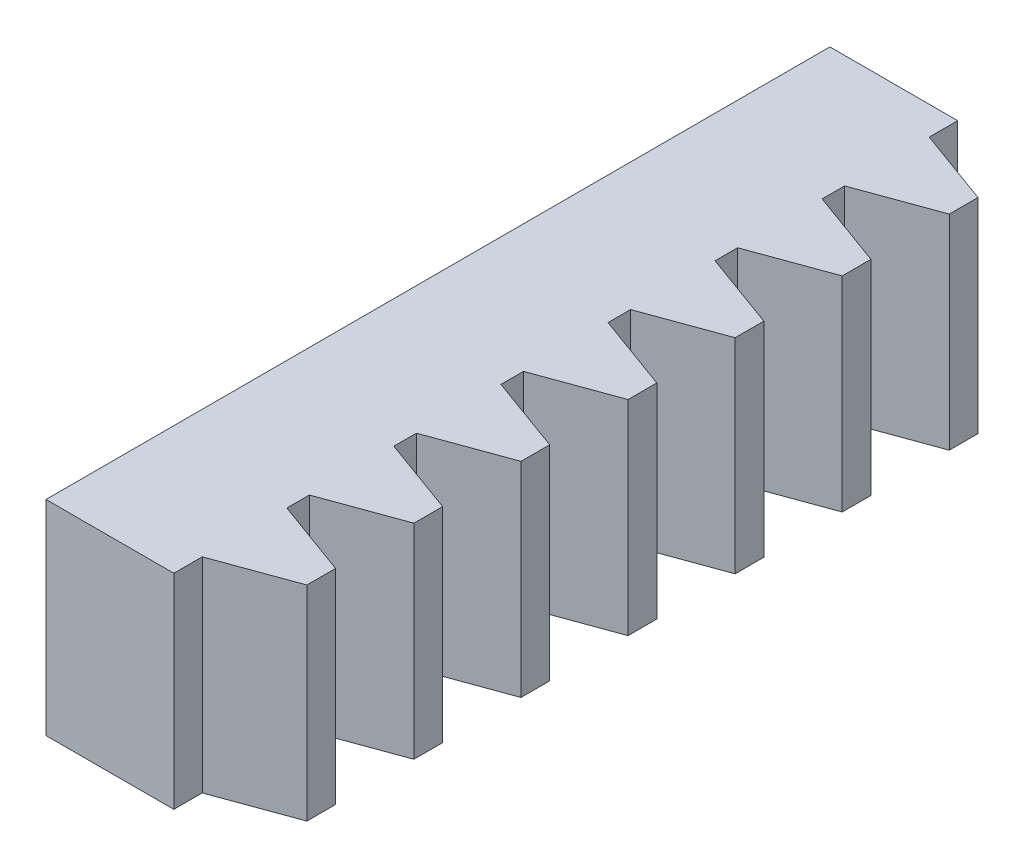
ISO-10303-21;
HEADER;
FILE_DESCRIPTION(('STEP AP214'),'2;1');
FILE_NAME('part.step','',(''),(''),'','','');
FILE_SCHEMA(('AUTOMOTIVE_DESIGN { 1 0 10303 214 1 1 1 1 }'));
ENDSEC;
DATA;
#1=APPLICATION_CONTEXT('core data for automotive mechanical design processes');
#2=APPLICATION_PROTOCOL_DEFINITION('international standard','automotive_design',2000,#1);
#3=PRODUCT_CONTEXT('',#1,'mechanical');
#4=PRODUCT('Part','Part','',(#3));
#5=PRODUCT_RELATED_PRODUCT_CATEGORY('part','',(#4));
#6=PRODUCT_DEFINITION_FORMATION('','',#4);
#7=PRODUCT_DEFINITION_CONTEXT('part definition',#1,'design');
#8=PRODUCT_DEFINITION('design','',#6,#7);
#9=PRODUCT_DEFINITION_SHAPE('','',#8);
#10=(LENGTH_UNIT() NAMED_UNIT(*) SI_UNIT(.MILLI.,.METRE.));
#11=(NAMED_UNIT(*) PLANE_ANGLE_UNIT() SI_UNIT($,.RADIAN.));
#12=(NAMED_UNIT(*) SI_UNIT($,.STERADIAN.) SOLID_ANGLE_UNIT());
#13=UNCERTAINTY_MEASURE_WITH_UNIT(LENGTH_MEASURE(1.E-05),#10,'distance_accuracy_value','');
#14=(GEOMETRIC_REPRESENTATION_CONTEXT(3) GLOBAL_UNCERTAINTY_ASSIGNED_CONTEXT((#13)) GLOBAL_UNIT_ASSIGNED_CONTEXT((#10,
#11,#12)) REPRESENTATION_CONTEXT('',''));
#15=CARTESIAN_POINT('',(0.,0.,0.));
#16=DIRECTION('',(0.,0.,1.));
#17=DIRECTION('',(1.,0.,0.));
#18=AXIS2_PLACEMENT_3D('',#15,#16,#17);
#19=CARTESIAN_POINT('',(0.75,-3.,-12.));
#20=DIRECTION('',(-1.,0.,0.));
#21=DIRECTION('',(0.,0.,1.));
#22=AXIS2_PLACEMENT_3D('',#19,#20,#21);
#23=PLANE('',#22);
#24=DIRECTION('',(0.,-1.,0.));
#25=VECTOR('',#24,1.);
#26=CARTESIAN_POINT('',(0.75,-3.,7.5236));
#27=LINE('',#26,#25);
#28=CARTESIAN_POINT('',(0.75,3.,7.5236));
#29=VERTEX_POINT('',#28);
#30=CARTESIAN_POINT('',(0.75,-3.,7.5236));
#31=VERTEX_POINT('',#30);
#32=EDGE_CURVE('E11',#29,#31,#27,.T.);
#33=ORIENTED_EDGE('',*,*,#32,.F.);
#34=DIRECTION('',(0.,0.,1.));
#35=VECTOR('',#34,1.);
#36=CARTESIAN_POINT('',(0.75,3.,-12.));
#37=LINE('',#36,#35);
#38=CARTESIAN_POINT('',(0.75,3.,8.1844));
#39=VERTEX_POINT('',#38);
#40=EDGE_CURVE('E612',#29,#39,#37,.T.);
#41=ORIENTED_EDGE('',*,*,#40,.T.);
#42=DIRECTION('',(0.,1.,0.));
#43=VECTOR('',#42,1.);
#44=CARTESIAN_POINT('',(0.75,-3.,8.1844));
#45=LINE('',#44,#43);
#46=CARTESIAN_POINT('',(0.75,-3.,8.1844));
#47=VERTEX_POINT('',#46);
#48=EDGE_CURVE('E443',#47,#39,#45,.T.);
#49=ORIENTED_EDGE('',*,*,#48,.F.);
#50=DIRECTION('',(0.,0.,1.));
#51=VECTOR('',#50,1.);
#52=CARTESIAN_POINT('',(0.75,-3.,-12.));
#53=LINE('',#52,#51);
#54=EDGE_CURVE('E491',#31,#47,#53,.T.);
#55=ORIENTED_EDGE('',*,*,#54,.F.);
#56=EDGE_LOOP('',(#33,#41,#49,#55));
#57=FACE_BOUND('',#56,.T.);
#58=ADVANCED_FACE('F41',(#57),#23,.F.);
#59=DIRECTION('',(0.,1.,0.));
#60=VECTOR('',#59,1.);
#61=CARTESIAN_POINT('',(0.75,-3.,5.0428));
#62=LINE('',#61,#60);
#63=CARTESIAN_POINT('',(0.75,-3.,5.0428));
#64=VERTEX_POINT('',#63);
#65=CARTESIAN_POINT('',(0.75,3.,5.0428));
#66=VERTEX_POINT('',#65);
#67=EDGE_CURVE('E47',#64,#66,#62,.T.);
#68=ORIENTED_EDGE('',*,*,#67,.F.);
#69=CARTESIAN_POINT('',(0.75,-3.,4.382));
#70=VERTEX_POINT('',#69);
#71=EDGE_CURVE('E489',#70,#64,#53,.T.);
#72=ORIENTED_EDGE('',*,*,#71,.F.);
#73=DIRECTION('',(0.,-1.,0.));
#74=VECTOR('',#73,1.);
#75=CARTESIAN_POINT('',(0.75,-3.,4.382));
#76=LINE('',#75,#74);
#77=CARTESIAN_POINT('',(0.75,3.,4.382));
#78=VERTEX_POINT('',#77);
#79=EDGE_CURVE('E464',#78,#70,#76,.T.);
#80=ORIENTED_EDGE('',*,*,#79,.F.);
#81=EDGE_CURVE('E478',#78,#66,#37,.T.);
#82=ORIENTED_EDGE('',*,*,#81,.T.);
#83=EDGE_LOOP('',(#68,#72,#80,#82));
#84=FACE_BOUND('',#83,.T.);
#85=ADVANCED_FACE('F546',(#84),#23,.F.);
#86=DIRECTION('',(0.,-1.,0.));
#87=VECTOR('',#86,1.);
#88=CARTESIAN_POINT('',(0.75,-3.,-5.0428));
#89=LINE('',#88,#87);
#90=CARTESIAN_POINT('',(0.75,3.,-5.0428));
#91=VERTEX_POINT('',#90);
#92=CARTESIAN_POINT('',(0.75,-3.,-5.0428));
#93=VERTEX_POINT('',#92);
#94=EDGE_CURVE('E466',#91,#93,#89,.T.);
#95=ORIENTED_EDGE('',*,*,#94,.F.);
#96=CARTESIAN_POINT('',(0.75,3.,-4.382));
#97=VERTEX_POINT('',#96);
#98=EDGE_CURVE('E578',#91,#97,#37,.T.);
#99=ORIENTED_EDGE('',*,*,#98,.T.);
#100=DIRECTION('',(0.,1.,0.));
#101=VECTOR('',#100,1.);
#102=CARTESIAN_POINT('',(0.75,-3.,-4.382));
#103=LINE('',#102,#101);
#104=CARTESIAN_POINT('',(0.75,-3.,-4.382));
#105=VERTEX_POINT('',#104);
#106=EDGE_CURVE('E455',#105,#97,#103,.T.);
#107=ORIENTED_EDGE('',*,*,#106,.F.);
#108=EDGE_CURVE('E597',#93,#105,#53,.T.);
#109=ORIENTED_EDGE('',*,*,#108,.F.);
#110=EDGE_LOOP('',(#95,#99,#107,#109));
#111=FACE_BOUND('',#110,.T.);
#112=ADVANCED_FACE('F554',(#111),#23,.F.);
#113=DIRECTION('',(0.,1.,0.));
#114=VECTOR('',#113,1.);
#115=CARTESIAN_POINT('',(0.75,-3.,-7.5236));
#116=LINE('',#115,#114);
#117=CARTESIAN_POINT('',(0.75,-3.,-7.5236));
#118=VERTEX_POINT('',#117);
#119=CARTESIAN_POINT('',(0.75,3.,-7.5236));
#120=VERTEX_POINT('',#119);
#121=EDGE_CURVE('E461',#118,#120,#116,.T.);
#122=ORIENTED_EDGE('',*,*,#121,.F.);
#123=CARTESIAN_POINT('',(0.75,-3.,-8.1844));
#124=VERTEX_POINT('',#123);
#125=EDGE_CURVE('E415',#124,#118,#53,.T.);
#126=ORIENTED_EDGE('',*,*,#125,.F.);
#127=DIRECTION('',(0.,-1.,0.));
#128=VECTOR('',#127,1.);
#129=CARTESIAN_POINT('',(0.75,-3.,-8.1844));
#130=LINE('',#129,#128);
#131=CARTESIAN_POINT('',(0.75,3.,-8.1844));
#132=VERTEX_POINT('',#131);
#133=EDGE_CURVE('E448',#132,#124,#130,.T.);
#134=ORIENTED_EDGE('',*,*,#133,.F.);
#135=EDGE_CURVE('E406',#132,#120,#37,.T.);
#136=ORIENTED_EDGE('',*,*,#135,.T.);
#137=EDGE_LOOP('',(#122,#126,#134,#136));
#138=FACE_BOUND('',#137,.T.);
#139=ADVANCED_FACE('F569',(#138),#23,.F.);
#140=DIRECTION('',(0.,1.,0.));
#141=VECTOR('',#140,1.);
#142=CARTESIAN_POINT('',(0.75,-3.,1.9012));
#143=LINE('',#142,#141);
#144=CARTESIAN_POINT('',(0.75,-3.,1.9012));
#145=VERTEX_POINT('',#144);
#146=CARTESIAN_POINT('',(0.75,3.,1.9012));
#147=VERTEX_POINT('',#146);
#148=EDGE_CURVE('E458',#145,#147,#143,.T.);
#149=ORIENTED_EDGE('',*,*,#148,.F.);
#150=CARTESIAN_POINT('',(0.75,-3.,1.2404));
#151=VERTEX_POINT('',#150);
#152=EDGE_CURVE('E495',#151,#145,#53,.T.);
#153=ORIENTED_EDGE('',*,*,#152,.F.);
#154=DIRECTION('',(0.,-1.,0.));
#155=VECTOR('',#154,1.);
#156=CARTESIAN_POINT('',(0.75,-3.,1.2404));
#157=LINE('',#156,#155);
#158=CARTESIAN_POINT('',(0.75,3.,1.2404));
#159=VERTEX_POINT('',#158);
#160=EDGE_CURVE('E441',#159,#151,#157,.T.);
#161=ORIENTED_EDGE('',*,*,#160,.F.);
#162=EDGE_CURVE('E582',#159,#147,#37,.T.);
#163=ORIENTED_EDGE('',*,*,#162,.T.);
#164=EDGE_LOOP('',(#149,#153,#161,#163));
#165=FACE_BOUND('',#164,.T.);
#166=ADVANCED_FACE('F564',(#165),#23,.F.);
#167=DIRECTION('',(0.,-1.,0.));
#168=VECTOR('',#167,1.);
#169=CARTESIAN_POINT('',(0.75,-3.,-1.9012));
#170=LINE('',#169,#168);
#171=CARTESIAN_POINT('',(0.75,3.,-1.9012));
#172=VERTEX_POINT('',#171);
#173=CARTESIAN_POINT('',(0.75,-3.,-1.9012));
#174=VERTEX_POINT('',#173);
#175=EDGE_CURVE('E456',#172,#174,#170,.T.);
#176=ORIENTED_EDGE('',*,*,#175,.F.);
#177=CARTESIAN_POINT('',(0.75,3.,-1.2404));
#178=VERTEX_POINT('',#177);
#179=EDGE_CURVE('E572',#172,#178,#37,.T.);
#180=ORIENTED_EDGE('',*,*,#179,.T.);
#181=DIRECTION('',(0.,1.,0.));
#182=VECTOR('',#181,1.);
#183=CARTESIAN_POINT('',(0.75,-3.,-1.2404));
#184=LINE('',#183,#182);
#185=CARTESIAN_POINT('',(0.75,-3.,-1.2404));
#186=VERTEX_POINT('',#185);
#187=EDGE_CURVE('E438',#186,#178,#184,.T.);
#188=ORIENTED_EDGE('',*,*,#187,.F.);
#189=EDGE_CURVE('E492',#174,#186,#53,.T.);
#190=ORIENTED_EDGE('',*,*,#189,.F.);
#191=EDGE_LOOP('',(#176,#180,#188,#190));
#192=FACE_BOUND('',#191,.T.);
#193=ADVANCED_FACE('F561',(#192),#23,.F.);
#194=DIRECTION('',(0.,1.,0.));
#195=VECTOR('',#194,1.);
#196=CARTESIAN_POINT('',(0.75,-3.,-10.6652));
#197=LINE('',#196,#195);
#198=CARTESIAN_POINT('',(0.75,-3.,-10.6652));
#199=VERTEX_POINT('',#198);
#200=CARTESIAN_POINT('',(0.75,3.,-10.6652));
#201=VERTEX_POINT('',#200);
#202=EDGE_CURVE('E449',#199,#201,#197,.T.);
#203=ORIENTED_EDGE('',*,*,#202,.F.);
#204=CARTESIAN_POINT('',(0.75,-3.,-11.5));
#205=VERTEX_POINT('',#204);
#206=EDGE_CURVE('E274',#205,#199,#53,.T.);
#207=ORIENTED_EDGE('',*,*,#206,.F.);
#208=DIRECTION('',(0.,1.,0.));
#209=VECTOR('',#208,1.);
#210=CARTESIAN_POINT('',(0.75,0.,-11.5));
#211=LINE('',#210,#209);
#212=CARTESIAN_POINT('',(0.75,3.,-11.5));
#213=VERTEX_POINT('',#212);
#214=EDGE_CURVE('E436',#205,#213,#211,.T.);
#215=ORIENTED_EDGE('',*,*,#214,.T.);
#216=EDGE_CURVE('E407',#213,#201,#37,.T.);
#217=ORIENTED_EDGE('',*,*,#216,.T.);
#218=EDGE_LOOP('',(#203,#207,#215,#217));
#219=FACE_BOUND('',#218,.T.);
#220=ADVANCED_FACE('F517',(#219),#23,.F.);
#221=DIRECTION('',(0.,-1.,0.));
#222=VECTOR('',#221,1.);
#223=CARTESIAN_POINT('',(0.75,-3.,10.6652));
#224=LINE('',#223,#222);
#225=CARTESIAN_POINT('',(0.75,3.,10.6652));
#226=VERTEX_POINT('',#225);
#227=CARTESIAN_POINT('',(0.75,-3.,10.6652));
#228=VERTEX_POINT('',#227);
#229=EDGE_CURVE('E57',#226,#228,#224,.T.);
#230=ORIENTED_EDGE('',*,*,#229,.F.);
#231=CARTESIAN_POINT('',(0.75,3.,11.5));
#232=VERTEX_POINT('',#231);
#233=EDGE_CURVE('E403',#226,#232,#37,.T.);
#234=ORIENTED_EDGE('',*,*,#233,.T.);
#235=DIRECTION('',(0.,1.,0.));
#236=VECTOR('',#235,1.);
#237=CARTESIAN_POINT('',(0.75,0.,11.5));
#238=LINE('',#237,#236);
#239=CARTESIAN_POINT('',(0.75,-3.,11.5));
#240=VERTEX_POINT('',#239);
#241=EDGE_CURVE('E411',#240,#232,#238,.T.);
#242=ORIENTED_EDGE('',*,*,#241,.F.);
#243=EDGE_CURVE('E410',#228,#240,#53,.T.);
#244=ORIENTED_EDGE('',*,*,#243,.F.);
#245=EDGE_LOOP('',(#230,#234,#242,#244));
#246=FACE_BOUND('',#245,.T.);
#247=ADVANCED_FACE('F501',(#246),#23,.F.);
#248=CARTESIAN_POINT('',(-3.,3.,11.5));
#249=DIRECTION('',(0.,-1.,0.));
#250=DIRECTION('',(0.,0.,-1.));
#251=AXIS2_PLACEMENT_3D('',#248,#249,#250);
#252=PLANE('',#251);
#253=ORIENTED_EDGE('',*,*,#40,.F.);
#254=DIRECTION('',(0.939683630956786,0.,-0.342044841668269));
#255=VECTOR('',#254,1.);
#256=CARTESIAN_POINT('',(3.,3.,6.7046));
#257=LINE('',#256,#255);
#258=CARTESIAN_POINT('',(3.,3.,6.7046));
#259=VERTEX_POINT('',#258);
#260=EDGE_CURVE('E336',#29,#259,#257,.T.);
#261=ORIENTED_EDGE('',*,*,#260,.T.);
#262=DIRECTION('',(0.,0.,-1.));
#263=VECTOR('',#262,1.);
#264=CARTESIAN_POINT('',(3.,3.,5.8618));
#265=LINE('',#264,#263);
#266=CARTESIAN_POINT('',(3.,3.,5.8618));
#267=VERTEX_POINT('',#266);
#268=EDGE_CURVE('E345',#259,#267,#265,.T.);
#269=ORIENTED_EDGE('',*,*,#268,.T.);
#270=DIRECTION('',(-0.939683630956786,0.,-0.34204484166827));
#271=VECTOR('',#270,1.);
#272=CARTESIAN_POINT('',(0.5,3.,4.9518));
#273=LINE('',#272,#271);
#274=EDGE_CURVE('E332',#267,#66,#273,.T.);
#275=ORIENTED_EDGE('',*,*,#274,.T.);
#276=ORIENTED_EDGE('',*,*,#81,.F.);
#277=DIRECTION('',(0.939683630956786,0.,-0.34204484166827));
#278=VECTOR('',#277,1.);
#279=CARTESIAN_POINT('',(3.,3.,3.563));
#280=LINE('',#279,#278);
#281=CARTESIAN_POINT('',(3.,3.,3.563));
#282=VERTEX_POINT('',#281);
#283=EDGE_CURVE('E377',#78,#282,#280,.T.);
#284=ORIENTED_EDGE('',*,*,#283,.T.);
#285=DIRECTION('',(0.,0.,-1.));
#286=VECTOR('',#285,1.);
#287=CARTESIAN_POINT('',(3.,3.,2.7202));
#288=LINE('',#287,#286);
#289=CARTESIAN_POINT('',(3.,3.,2.7202));
#290=VERTEX_POINT('',#289);
#291=EDGE_CURVE('E384',#282,#290,#288,.T.);
#292=ORIENTED_EDGE('',*,*,#291,.T.);
#293=DIRECTION('',(-0.939683630956785,0.,-0.34204484166827));
#294=VECTOR('',#293,1.);
#295=CARTESIAN_POINT('',(0.5,3.,1.8102));
#296=LINE('',#295,#294);
#297=EDGE_CURVE('E373',#290,#147,#296,.T.);
#298=ORIENTED_EDGE('',*,*,#297,.T.);
#299=ORIENTED_EDGE('',*,*,#162,.F.);
#300=DIRECTION('',(0.939683630956786,0.,-0.34204484166827));
#301=VECTOR('',#300,1.);
#302=CARTESIAN_POINT('',(3.,3.,0.4214));
#303=LINE('',#302,#301);
#304=CARTESIAN_POINT('',(3.,3.,0.4214));
#305=VERTEX_POINT('',#304);
#306=EDGE_CURVE('E387',#159,#305,#303,.T.);
#307=ORIENTED_EDGE('',*,*,#306,.T.);
#308=DIRECTION('',(0.,0.,-1.));
#309=VECTOR('',#308,1.);
#310=CARTESIAN_POINT('',(3.,3.,-0.4214));
#311=LINE('',#310,#309);
#312=CARTESIAN_POINT('',(3.,3.,-0.4214));
#313=VERTEX_POINT('',#312);
#314=EDGE_CURVE('E390',#305,#313,#311,.T.);
#315=ORIENTED_EDGE('',*,*,#314,.T.);
#316=DIRECTION('',(-0.939683630956786,0.,-0.34204484166827));
#317=VECTOR('',#316,1.);
#318=CARTESIAN_POINT('',(0.5,3.,-1.3314));
#319=LINE('',#318,#317);
#320=EDGE_CURVE('E391',#313,#178,#319,.T.);
#321=ORIENTED_EDGE('',*,*,#320,.T.);
#322=ORIENTED_EDGE('',*,*,#179,.F.);
#323=DIRECTION('',(0.939683630956785,0.,-0.34204484166827));
#324=VECTOR('',#323,1.);
#325=CARTESIAN_POINT('',(3.,3.,-2.7202));
#326=LINE('',#325,#324);
#327=CARTESIAN_POINT('',(3.,3.,-2.7202));
#328=VERTEX_POINT('',#327);
#329=EDGE_CURVE('E356',#172,#328,#326,.T.);
#330=ORIENTED_EDGE('',*,*,#329,.T.);
#331=DIRECTION('',(0.,0.,-1.));
#332=VECTOR('',#331,1.);
#333=CARTESIAN_POINT('',(3.,3.,-3.563));
#334=LINE('',#333,#332);
#335=CARTESIAN_POINT('',(3.,3.,-3.563));
#336=VERTEX_POINT('',#335);
#337=EDGE_CURVE('E362',#328,#336,#334,.T.);
#338=ORIENTED_EDGE('',*,*,#337,.T.);
#339=DIRECTION('',(-0.939683630956786,0.,-0.34204484166827));
#340=VECTOR('',#339,1.);
#341=CARTESIAN_POINT('',(0.5,3.,-4.473));
#342=LINE('',#341,#340);
#343=EDGE_CURVE('E352',#336,#97,#342,.T.);
#344=ORIENTED_EDGE('',*,*,#343,.T.);
#345=ORIENTED_EDGE('',*,*,#98,.F.);
#346=DIRECTION('',(0.939683630956786,0.,-0.34204484166827));
#347=VECTOR('',#346,1.);
#348=CARTESIAN_POINT('',(3.,3.,-5.8618));
#349=LINE('',#348,#347);
#350=CARTESIAN_POINT('',(3.,3.,-5.8618));
#351=VERTEX_POINT('',#350);
#352=EDGE_CURVE('E319',#91,#351,#349,.T.);
#353=ORIENTED_EDGE('',*,*,#352,.T.);
#354=DIRECTION('',(0.,0.,-1.));
#355=VECTOR('',#354,1.);
#356=CARTESIAN_POINT('',(3.,3.,-6.7046));
#357=LINE('',#356,#355);
#358=CARTESIAN_POINT('',(3.,3.,-6.7046));
#359=VERTEX_POINT('',#358);
#360=EDGE_CURVE('E323',#351,#359,#357,.T.);
#361=ORIENTED_EDGE('',*,*,#360,.T.);
#362=DIRECTION('',(-0.939683630956786,0.,-0.342044841668269));
#363=VECTOR('',#362,1.);
#364=CARTESIAN_POINT('',(0.5,3.,-7.6146));
#365=LINE('',#364,#363);
#366=EDGE_CURVE('E312',#359,#120,#365,.T.);
#367=ORIENTED_EDGE('',*,*,#366,.T.);
#368=ORIENTED_EDGE('',*,*,#135,.F.);
#369=DIRECTION('',(0.939683630956785,0.,-0.34204484166827));
#370=VECTOR('',#369,1.);
#371=CARTESIAN_POINT('',(3.,3.,-9.0034));
#372=LINE('',#371,#370);
#373=CARTESIAN_POINT('',(3.,3.,-9.0034));
#374=VERTEX_POINT('',#373);
#375=EDGE_CURVE('E273',#132,#374,#372,.T.);
#376=ORIENTED_EDGE('',*,*,#375,.T.);
#377=DIRECTION('',(0.,0.,-1.));
#378=VECTOR('',#377,1.);
#379=CARTESIAN_POINT('',(3.,3.,-9.8462));
#380=LINE('',#379,#378);
#381=CARTESIAN_POINT('',(3.,3.,-9.8462));
#382=VERTEX_POINT('',#381);
#383=EDGE_CURVE('E279',#374,#382,#380,.T.);
#384=ORIENTED_EDGE('',*,*,#383,.T.);
#385=DIRECTION('',(-0.939683630956785,0.,-0.34204484166827));
#386=VECTOR('',#385,1.);
#387=CARTESIAN_POINT('',(0.5,3.,-10.7562));
#388=LINE('',#387,#386);
#389=EDGE_CURVE('E267',#382,#201,#388,.T.);
#390=ORIENTED_EDGE('',*,*,#389,.T.);
#391=ORIENTED_EDGE('',*,*,#216,.F.);
#392=DIRECTION('',(-1.,0.,0.));
#393=VECTOR('',#392,1.);
#394=CARTESIAN_POINT('',(-3.,3.,-11.5));
#395=LINE('',#394,#393);
#396=CARTESIAN_POINT('',(-3.,3.,-11.5));
#397=VERTEX_POINT('',#396);
#398=EDGE_CURVE('E416',#213,#397,#395,.T.);
#399=ORIENTED_EDGE('',*,*,#398,.T.);
#400=DIRECTION('',(0.,0.,-1.));
#401=VECTOR('',#400,1.);
#402=CARTESIAN_POINT('',(-3.,3.,11.5));
#403=LINE('',#402,#401);
#404=CARTESIAN_POINT('',(-3.,3.,11.5));
#405=VERTEX_POINT('',#404);
#406=EDGE_CURVE('E424',#405,#397,#403,.T.);
#407=ORIENTED_EDGE('',*,*,#406,.F.);
#408=DIRECTION('',(-1.,0.,0.));
#409=VECTOR('',#408,1.);
#410=CARTESIAN_POINT('',(-3.,3.,11.5));
#411=LINE('',#410,#409);
#412=EDGE_CURVE('E421',#232,#405,#411,.T.);
#413=ORIENTED_EDGE('',*,*,#412,.F.);
#414=ORIENTED_EDGE('',*,*,#233,.F.);
#415=DIRECTION('',(0.939683630956785,0.,-0.34204484166827));
#416=VECTOR('',#415,1.);
#417=CARTESIAN_POINT('',(3.,3.,9.8462));
#418=LINE('',#417,#416);
#419=CARTESIAN_POINT('',(3.,3.,9.8462));
#420=VERTEX_POINT('',#419);
#421=EDGE_CURVE('E300',#226,#420,#418,.T.);
#422=ORIENTED_EDGE('',*,*,#421,.T.);
#423=DIRECTION('',(0.,0.,-1.));
#424=VECTOR('',#423,1.);
#425=CARTESIAN_POINT('',(3.,3.,9.0034));
#426=LINE('',#425,#424);
#427=CARTESIAN_POINT('',(3.,3.,9.0034));
#428=VERTEX_POINT('',#427);
#429=EDGE_CURVE('E303',#420,#428,#426,.T.);
#430=ORIENTED_EDGE('',*,*,#429,.T.);
#431=DIRECTION('',(-0.939683630956785,0.,-0.34204484166827));
#432=VECTOR('',#431,1.);
#433=CARTESIAN_POINT('',(0.5,3.,8.0934));
#434=LINE('',#433,#432);
#435=EDGE_CURVE('E292',#428,#39,#434,.T.);
#436=ORIENTED_EDGE('',*,*,#435,.T.);
#437=EDGE_LOOP('',(#253,#261,#269,#275,#276,#284,#292,#298,#299,#307,#315,#321,#322,#330,#338,
#344,#345,#353,#361,#367,#368,#376,#384,#390,#391,#399,#407,#413,#414,#422,#430,#436));
#438=FACE_BOUND('',#437,.T.);
#439=ADVANCED_FACE('F477',(#438),#252,.F.);
#440=CARTESIAN_POINT('',(-3.,-3.,11.5));
#441=DIRECTION('',(1.,0.,0.));
#442=DIRECTION('',(0.,0.,-1.));
#443=AXIS2_PLACEMENT_3D('',#440,#441,#442);
#444=PLANE('',#443);
#445=DIRECTION('',(0.,-1.,0.));
#446=VECTOR('',#445,1.);
#447=CARTESIAN_POINT('',(-3.,-3.,-11.5));
#448=LINE('',#447,#446);
#449=CARTESIAN_POINT('',(-3.,-3.,-11.5));
#450=VERTEX_POINT('',#449);
#451=EDGE_CURVE('E414',#397,#450,#448,.T.);
#452=ORIENTED_EDGE('',*,*,#451,.T.);
#453=DIRECTION('',(0.,0.,-1.));
#454=VECTOR('',#453,1.);
#455=CARTESIAN_POINT('',(-3.,-3.,11.5));
#456=LINE('',#455,#454);
#457=CARTESIAN_POINT('',(-3.,-3.,11.5));
#458=VERTEX_POINT('',#457);
#459=EDGE_CURVE('E433',#458,#450,#456,.T.);
#460=ORIENTED_EDGE('',*,*,#459,.F.);
#461=DIRECTION('',(0.,-1.,0.));
#462=VECTOR('',#461,1.);
#463=CARTESIAN_POINT('',(-3.,-3.,11.5));
#464=LINE('',#463,#462);
#465=EDGE_CURVE('E418',#405,#458,#464,.T.);
#466=ORIENTED_EDGE('',*,*,#465,.F.);
#467=ORIENTED_EDGE('',*,*,#406,.T.);
#468=EDGE_LOOP('',(#452,#460,#466,#467));
#469=FACE_BOUND('',#468,.T.);
#470=ADVANCED_FACE('F43',(#469),#444,.F.);
#471=CARTESIAN_POINT('',(-3.,-3.,11.5));
#472=DIRECTION('',(0.,1.,0.));
#473=DIRECTION('',(0.,0.,1.));
#474=AXIS2_PLACEMENT_3D('',#471,#472,#473);
#475=PLANE('',#474);
#476=ORIENTED_EDGE('',*,*,#71,.T.);
#477=DIRECTION('',(-0.939683630956786,0.,-0.34204484166827));
#478=VECTOR('',#477,1.);
#479=CARTESIAN_POINT('',(0.5,-3.,4.9518));
#480=LINE('',#479,#478);
#481=CARTESIAN_POINT('',(3.,-3.,5.8618));
#482=VERTEX_POINT('',#481);
#483=EDGE_CURVE('E335',#482,#64,#480,.T.);
#484=ORIENTED_EDGE('',*,*,#483,.F.);
#485=DIRECTION('',(0.,0.,-1.));
#486=VECTOR('',#485,1.);
#487=CARTESIAN_POINT('',(3.,-3.,5.8618));
#488=LINE('',#487,#486);
#489=CARTESIAN_POINT('',(3.,-3.,6.7046));
#490=VERTEX_POINT('',#489);
#491=EDGE_CURVE('E340',#490,#482,#488,.T.);
#492=ORIENTED_EDGE('',*,*,#491,.F.);
#493=DIRECTION('',(0.939683630956786,0.,-0.342044841668269));
#494=VECTOR('',#493,1.);
#495=CARTESIAN_POINT('',(3.,-3.,6.7046));
#496=LINE('',#495,#494);
#497=EDGE_CURVE('E309',#31,#490,#496,.T.);
#498=ORIENTED_EDGE('',*,*,#497,.F.);
#499=ORIENTED_EDGE('',*,*,#54,.T.);
#500=DIRECTION('',(-0.939683630956785,0.,-0.34204484166827));
#501=VECTOR('',#500,1.);
#502=CARTESIAN_POINT('',(0.5,-3.,8.0934));
#503=LINE('',#502,#501);
#504=CARTESIAN_POINT('',(3.,-3.,9.0034));
#505=VERTEX_POINT('',#504);
#506=EDGE_CURVE('E291',#505,#47,#503,.T.);
#507=ORIENTED_EDGE('',*,*,#506,.F.);
#508=DIRECTION('',(0.,0.,-1.));
#509=VECTOR('',#508,1.);
#510=CARTESIAN_POINT('',(3.,-3.,9.0034));
#511=LINE('',#510,#509);
#512=CARTESIAN_POINT('',(3.,-3.,9.8462));
#513=VERTEX_POINT('',#512);
#514=EDGE_CURVE('E298',#513,#505,#511,.T.);
#515=ORIENTED_EDGE('',*,*,#514,.F.);
#516=DIRECTION('',(0.939683630956785,0.,-0.34204484166827));
#517=VECTOR('',#516,1.);
#518=CARTESIAN_POINT('',(3.,-3.,9.8462));
#519=LINE('',#518,#517);
#520=EDGE_CURVE('E299',#228,#513,#519,.T.);
#521=ORIENTED_EDGE('',*,*,#520,.F.);
#522=ORIENTED_EDGE('',*,*,#243,.T.);
#523=DIRECTION('',(1.,0.,0.));
#524=VECTOR('',#523,1.);
#525=CARTESIAN_POINT('',(-3.,-3.,11.5));
#526=LINE('',#525,#524);
#527=EDGE_CURVE('E420',#458,#240,#526,.T.);
#528=ORIENTED_EDGE('',*,*,#527,.F.);
#529=ORIENTED_EDGE('',*,*,#459,.T.);
#530=DIRECTION('',(1.,0.,0.));
#531=VECTOR('',#530,1.);
#532=CARTESIAN_POINT('',(-3.,-3.,-11.5));
#533=LINE('',#532,#531);
#534=EDGE_CURVE('E426',#450,#205,#533,.T.);
#535=ORIENTED_EDGE('',*,*,#534,.T.);
#536=ORIENTED_EDGE('',*,*,#206,.T.);
#537=DIRECTION('',(-0.939683630956785,0.,-0.34204484166827));
#538=VECTOR('',#537,1.);
#539=CARTESIAN_POINT('',(0.5,-3.,-10.7562));
#540=LINE('',#539,#538);
#541=CARTESIAN_POINT('',(3.,-3.,-9.8462));
#542=VERTEX_POINT('',#541);
#543=EDGE_CURVE('E261',#542,#199,#540,.T.);
#544=ORIENTED_EDGE('',*,*,#543,.F.);
#545=DIRECTION('',(0.,0.,-1.));
#546=VECTOR('',#545,1.);
#547=CARTESIAN_POINT('',(3.,-3.,-9.8462));
#548=LINE('',#547,#546);
#549=CARTESIAN_POINT('',(3.,-3.,-9.0034));
#550=VERTEX_POINT('',#549);
#551=EDGE_CURVE('E248',#550,#542,#548,.T.);
#552=ORIENTED_EDGE('',*,*,#551,.F.);
#553=DIRECTION('',(0.939683630956785,0.,-0.34204484166827));
#554=VECTOR('',#553,1.);
#555=CARTESIAN_POINT('',(3.,-3.,-9.0034));
#556=LINE('',#555,#554);
#557=EDGE_CURVE('E258',#124,#550,#556,.T.);
#558=ORIENTED_EDGE('',*,*,#557,.F.);
#559=ORIENTED_EDGE('',*,*,#125,.T.);
#560=DIRECTION('',(-0.939683630956786,0.,-0.342044841668269));
#561=VECTOR('',#560,1.);
#562=CARTESIAN_POINT('',(0.5,-3.,-7.6146));
#563=LINE('',#562,#561);
#564=CARTESIAN_POINT('',(3.,-3.,-6.7046));
#565=VERTEX_POINT('',#564);
#566=EDGE_CURVE('E313',#565,#118,#563,.T.);
#567=ORIENTED_EDGE('',*,*,#566,.F.);
#568=DIRECTION('',(0.,0.,-1.));
#569=VECTOR('',#568,1.);
#570=CARTESIAN_POINT('',(3.,-3.,-6.7046));
#571=LINE('',#570,#569);
#572=CARTESIAN_POINT('',(3.,-3.,-5.8618));
#573=VERTEX_POINT('',#572);
#574=EDGE_CURVE('E320',#573,#565,#571,.T.);
#575=ORIENTED_EDGE('',*,*,#574,.F.);
#576=DIRECTION('',(0.939683630956786,0.,-0.34204484166827));
#577=VECTOR('',#576,1.);
#578=CARTESIAN_POINT('',(3.,-3.,-5.8618));
#579=LINE('',#578,#577);
#580=EDGE_CURVE('E318',#93,#573,#579,.T.);
#581=ORIENTED_EDGE('',*,*,#580,.F.);
#582=ORIENTED_EDGE('',*,*,#108,.T.);
#583=DIRECTION('',(-0.939683630956786,0.,-0.34204484166827));
#584=VECTOR('',#583,1.);
#585=CARTESIAN_POINT('',(0.5,-3.,-4.473));
#586=LINE('',#585,#584);
#587=CARTESIAN_POINT('',(3.,-3.,-3.563));
#588=VERTEX_POINT('',#587);
#589=EDGE_CURVE('E355',#588,#105,#586,.T.);
#590=ORIENTED_EDGE('',*,*,#589,.F.);
#591=DIRECTION('',(0.,0.,-1.));
#592=VECTOR('',#591,1.);
#593=CARTESIAN_POINT('',(3.,-3.,-3.563));
#594=LINE('',#593,#592);
#595=CARTESIAN_POINT('',(3.,-3.,-2.7202));
#596=VERTEX_POINT('',#595);
#597=EDGE_CURVE('E357',#596,#588,#594,.T.);
#598=ORIENTED_EDGE('',*,*,#597,.F.);
#599=DIRECTION('',(0.939683630956785,0.,-0.34204484166827));
#600=VECTOR('',#599,1.);
#601=CARTESIAN_POINT('',(3.,-3.,-2.7202));
#602=LINE('',#601,#600);
#603=EDGE_CURVE('E359',#174,#596,#602,.T.);
#604=ORIENTED_EDGE('',*,*,#603,.F.);
#605=ORIENTED_EDGE('',*,*,#189,.T.);
#606=DIRECTION('',(-0.939683630956786,0.,-0.34204484166827));
#607=VECTOR('',#606,1.);
#608=CARTESIAN_POINT('',(0.5,-3.,-1.3314));
#609=LINE('',#608,#607);
#610=CARTESIAN_POINT('',(3.,-3.,-0.4214));
#611=VERTEX_POINT('',#610);
#612=EDGE_CURVE('E386',#611,#186,#609,.T.);
#613=ORIENTED_EDGE('',*,*,#612,.F.);
#614=DIRECTION('',(0.,0.,-1.));
#615=VECTOR('',#614,1.);
#616=CARTESIAN_POINT('',(3.,-3.,-0.4214));
#617=LINE('',#616,#615);
#618=CARTESIAN_POINT('',(3.,-3.,0.4214));
#619=VERTEX_POINT('',#618);
#620=EDGE_CURVE('E398',#619,#611,#617,.T.);
#621=ORIENTED_EDGE('',*,*,#620,.F.);
#622=DIRECTION('',(0.939683630956786,0.,-0.34204484166827));
#623=VECTOR('',#622,1.);
#624=CARTESIAN_POINT('',(3.,-3.,0.4214));
#625=LINE('',#624,#623);
#626=EDGE_CURVE('E365',#151,#619,#625,.T.);
#627=ORIENTED_EDGE('',*,*,#626,.F.);
#628=ORIENTED_EDGE('',*,*,#152,.T.);
#629=DIRECTION('',(-0.939683630956785,0.,-0.34204484166827));
#630=VECTOR('',#629,1.);
#631=CARTESIAN_POINT('',(0.5,-3.,1.8102));
#632=LINE('',#631,#630);
#633=CARTESIAN_POINT('',(3.,-3.,2.7202));
#634=VERTEX_POINT('',#633);
#635=EDGE_CURVE('E372',#634,#145,#632,.T.);
#636=ORIENTED_EDGE('',*,*,#635,.F.);
#637=DIRECTION('',(0.,0.,-1.));
#638=VECTOR('',#637,1.);
#639=CARTESIAN_POINT('',(3.,-3.,2.7202));
#640=LINE('',#639,#638);
#641=CARTESIAN_POINT('',(3.,-3.,3.563));
#642=VERTEX_POINT('',#641);
#643=EDGE_CURVE('E380',#642,#634,#640,.T.);
#644=ORIENTED_EDGE('',*,*,#643,.F.);
#645=DIRECTION('',(0.939683630956786,0.,-0.34204484166827));
#646=VECTOR('',#645,1.);
#647=CARTESIAN_POINT('',(3.,-3.,3.563));
#648=LINE('',#647,#646);
#649=EDGE_CURVE('E349',#70,#642,#648,.T.);
#650=ORIENTED_EDGE('',*,*,#649,.F.);
#651=EDGE_LOOP('',(#476,#484,#492,#498,#499,#507,#515,#521,#522,#528,#529,#535,#536,#544,#552,
#558,#559,#567,#575,#581,#582,#590,#598,#604,#605,#613,#621,#627,#628,#636,#644,#650));
#652=FACE_BOUND('',#651,.T.);
#653=ADVANCED_FACE('F275',(#652),#475,.F.);
#654=CARTESIAN_POINT('',(0.,0.,11.5));
#655=DIRECTION('',(0.,0.,-1.));
#656=DIRECTION('',(-1.,0.,0.));
#657=AXIS2_PLACEMENT_3D('',#654,#655,#656);
#658=PLANE('',#657);
#659=ORIENTED_EDGE('',*,*,#527,.T.);
#660=ORIENTED_EDGE('',*,*,#241,.T.);
#661=ORIENTED_EDGE('',*,*,#412,.T.);
#662=ORIENTED_EDGE('',*,*,#465,.T.);
#663=EDGE_LOOP('',(#659,#660,#661,#662));
#664=FACE_BOUND('',#663,.T.);
#665=ADVANCED_FACE('F502',(#664),#658,.F.);
#666=CARTESIAN_POINT('',(0.,0.,-11.5));
#667=DIRECTION('',(0.,0.,-1.));
#668=DIRECTION('',(-1.,0.,0.));
#669=AXIS2_PLACEMENT_3D('',#666,#667,#668);
#670=PLANE('',#669);
#671=CARTESIAN_POINT('',(-1.25,0.,-11.5));
#672=DIRECTION('',(0.,0.,-1.));
#673=DIRECTION('',(-1.,0.,0.));
#674=AXIS2_PLACEMENT_3D('',#671,#672,#673);
#675=CIRCLE('',#674,1.00132039826318);
#676=CARTESIAN_POINT('',(-2.25132039826318,0.,-11.5));
#677=VERTEX_POINT('',#676);
#678=EDGE_CURVE('E525',#677,#677,#675,.T.);
#679=ORIENTED_EDGE('',*,*,#678,.F.);
#680=EDGE_LOOP('',(#679));
#681=FACE_BOUND('',#680,.T.);
#682=ORIENTED_EDGE('',*,*,#214,.F.);
#683=ORIENTED_EDGE('',*,*,#534,.F.);
#684=ORIENTED_EDGE('',*,*,#451,.F.);
#685=ORIENTED_EDGE('',*,*,#398,.F.);
#686=EDGE_LOOP('',(#682,#683,#684,#685));
#687=FACE_BOUND('',#686,.T.);
#688=ADVANCED_FACE('F515',(#681,#687),#670,.T.);
#689=CARTESIAN_POINT('',(3.,3.,0.4214));
#690=DIRECTION('',(-0.34204484166827,0.,-0.939683630956785));
#691=DIRECTION('',(-0.939683630956786,0.,0.34204484166827));
#692=AXIS2_PLACEMENT_3D('',#689,#690,#691);
#693=PLANE('',#692);
#694=ORIENTED_EDGE('',*,*,#306,.F.);
#695=ORIENTED_EDGE('',*,*,#160,.T.);
#696=ORIENTED_EDGE('',*,*,#626,.T.);
#697=DIRECTION('',(0.,-1.,0.));
#698=VECTOR('',#697,1.);
#699=CARTESIAN_POINT('',(3.,3.,0.4214));
#700=LINE('',#699,#698);
#701=EDGE_CURVE('E405',#305,#619,#700,.T.);
#702=ORIENTED_EDGE('',*,*,#701,.F.);
#703=EDGE_LOOP('',(#694,#695,#696,#702));
#704=FACE_BOUND('',#703,.T.);
#705=ADVANCED_FACE('F539',(#704),#693,.F.);
#706=CARTESIAN_POINT('',(0.5,3.,-1.3314));
#707=DIRECTION('',(-0.34204484166827,0.,0.939683630956785));
#708=DIRECTION('',(0.939683630956786,0.,0.34204484166827));
#709=AXIS2_PLACEMENT_3D('',#706,#707,#708);
#710=PLANE('',#709);
#711=ORIENTED_EDGE('',*,*,#612,.T.);
#712=ORIENTED_EDGE('',*,*,#187,.T.);
#713=ORIENTED_EDGE('',*,*,#320,.F.);
#714=DIRECTION('',(0.,-1.,0.));
#715=VECTOR('',#714,1.);
#716=CARTESIAN_POINT('',(3.,3.,-0.4214));
#717=LINE('',#716,#715);
#718=EDGE_CURVE('E393',#313,#611,#717,.T.);
#719=ORIENTED_EDGE('',*,*,#718,.T.);
#720=EDGE_LOOP('',(#711,#712,#713,#719));
#721=FACE_BOUND('',#720,.T.);
#722=ADVANCED_FACE('F542',(#721),#710,.F.);
#723=CARTESIAN_POINT('',(3.,3.,-0.4214));
#724=DIRECTION('',(-1.,0.,0.));
#725=DIRECTION('',(0.,0.,1.));
#726=AXIS2_PLACEMENT_3D('',#723,#724,#725);
#727=PLANE('',#726);
#728=ORIENTED_EDGE('',*,*,#620,.T.);
#729=ORIENTED_EDGE('',*,*,#718,.F.);
#730=ORIENTED_EDGE('',*,*,#314,.F.);
#731=ORIENTED_EDGE('',*,*,#701,.T.);
#732=EDGE_LOOP('',(#728,#729,#730,#731));
#733=FACE_BOUND('',#732,.T.);
#734=ADVANCED_FACE('F606',(#733),#727,.F.);
#735=CARTESIAN_POINT('',(3.,3.,9.8462));
#736=DIRECTION('',(-0.34204484166827,0.,-0.939683630956785));
#737=DIRECTION('',(-0.939683630956785,0.,0.34204484166827));
#738=AXIS2_PLACEMENT_3D('',#735,#736,#737);
#739=PLANE('',#738);
#740=ORIENTED_EDGE('',*,*,#421,.F.);
#741=ORIENTED_EDGE('',*,*,#229,.T.);
#742=ORIENTED_EDGE('',*,*,#520,.T.);
#743=DIRECTION('',(0.,-1.,0.));
#744=VECTOR('',#743,1.);
#745=CARTESIAN_POINT('',(3.,3.,9.8462));
#746=LINE('',#745,#744);
#747=EDGE_CURVE('E284',#420,#513,#746,.T.);
#748=ORIENTED_EDGE('',*,*,#747,.F.);
#749=EDGE_LOOP('',(#740,#741,#742,#748));
#750=FACE_BOUND('',#749,.T.);
#751=ADVANCED_FACE('F624',(#750),#739,.F.);
#752=CARTESIAN_POINT('',(0.5,3.,8.0934));
#753=DIRECTION('',(-0.34204484166827,0.,0.939683630956785));
#754=DIRECTION('',(0.939683630956785,0.,0.34204484166827));
#755=AXIS2_PLACEMENT_3D('',#752,#753,#754);
#756=PLANE('',#755);
#757=ORIENTED_EDGE('',*,*,#506,.T.);
#758=ORIENTED_EDGE('',*,*,#48,.T.);
#759=ORIENTED_EDGE('',*,*,#435,.F.);
#760=DIRECTION('',(0.,-1.,0.));
#761=VECTOR('',#760,1.);
#762=CARTESIAN_POINT('',(3.,3.,9.0034));
#763=LINE('',#762,#761);
#764=EDGE_CURVE('E287',#428,#505,#763,.T.);
#765=ORIENTED_EDGE('',*,*,#764,.T.);
#766=EDGE_LOOP('',(#757,#758,#759,#765));
#767=FACE_BOUND('',#766,.T.);
#768=ADVANCED_FACE('F618',(#767),#756,.F.);
#769=CARTESIAN_POINT('',(3.,3.,9.0034));
#770=DIRECTION('',(-1.,0.,0.));
#771=DIRECTION('',(0.,0.,1.));
#772=AXIS2_PLACEMENT_3D('',#769,#770,#771);
#773=PLANE('',#772);
#774=ORIENTED_EDGE('',*,*,#514,.T.);
#775=ORIENTED_EDGE('',*,*,#764,.F.);
#776=ORIENTED_EDGE('',*,*,#429,.F.);
#777=ORIENTED_EDGE('',*,*,#747,.T.);
#778=EDGE_LOOP('',(#774,#775,#776,#777));
#779=FACE_BOUND('',#778,.T.);
#780=ADVANCED_FACE('F625',(#779),#773,.F.);
#781=CARTESIAN_POINT('',(3.,3.,-9.0034));
#782=DIRECTION('',(-0.34204484166827,0.,-0.939683630956785));
#783=DIRECTION('',(-0.939683630956785,0.,0.34204484166827));
#784=AXIS2_PLACEMENT_3D('',#781,#782,#783);
#785=PLANE('',#784);
#786=ORIENTED_EDGE('',*,*,#375,.F.);
#787=ORIENTED_EDGE('',*,*,#133,.T.);
#788=ORIENTED_EDGE('',*,*,#557,.T.);
#789=DIRECTION('',(0.,-1.,0.));
#790=VECTOR('',#789,1.);
#791=CARTESIAN_POINT('',(3.,3.,-9.0034));
#792=LINE('',#791,#790);
#793=EDGE_CURVE('E257',#374,#550,#792,.T.);
#794=ORIENTED_EDGE('',*,*,#793,.F.);
#795=EDGE_LOOP('',(#786,#787,#788,#794));
#796=FACE_BOUND('',#795,.T.);
#797=ADVANCED_FACE('F518',(#796),#785,.F.);
#798=CARTESIAN_POINT('',(0.5,3.,-10.7562));
#799=DIRECTION('',(-0.34204484166827,0.,0.939683630956785));
#800=DIRECTION('',(0.939683630956785,0.,0.34204484166827));
#801=AXIS2_PLACEMENT_3D('',#798,#799,#800);
#802=PLANE('',#801);
#803=ORIENTED_EDGE('',*,*,#543,.T.);
#804=ORIENTED_EDGE('',*,*,#202,.T.);
#805=ORIENTED_EDGE('',*,*,#389,.F.);
#806=DIRECTION('',(0.,-1.,0.));
#807=VECTOR('',#806,1.);
#808=CARTESIAN_POINT('',(3.,3.,-9.8462));
#809=LINE('',#808,#807);
#810=EDGE_CURVE('E254',#382,#542,#809,.T.);
#811=ORIENTED_EDGE('',*,*,#810,.T.);
#812=EDGE_LOOP('',(#803,#804,#805,#811));
#813=FACE_BOUND('',#812,.T.);
#814=ADVANCED_FACE('F264',(#813),#802,.F.);
#815=CARTESIAN_POINT('',(3.,3.,-9.8462));
#816=DIRECTION('',(-1.,0.,0.));
#817=DIRECTION('',(0.,0.,1.));
#818=AXIS2_PLACEMENT_3D('',#815,#816,#817);
#819=PLANE('',#818);
#820=ORIENTED_EDGE('',*,*,#551,.T.);
#821=ORIENTED_EDGE('',*,*,#810,.F.);
#822=ORIENTED_EDGE('',*,*,#383,.F.);
#823=ORIENTED_EDGE('',*,*,#793,.T.);
#824=EDGE_LOOP('',(#820,#821,#822,#823));
#825=FACE_BOUND('',#824,.T.);
#826=ADVANCED_FACE('F252',(#825),#819,.F.);
#827=CARTESIAN_POINT('',(3.,3.,-2.7202));
#828=DIRECTION('',(-0.34204484166827,0.,-0.939683630956785));
#829=DIRECTION('',(-0.939683630956786,0.,0.34204484166827));
#830=AXIS2_PLACEMENT_3D('',#827,#828,#829);
#831=PLANE('',#830);
#832=ORIENTED_EDGE('',*,*,#329,.F.);
#833=ORIENTED_EDGE('',*,*,#175,.T.);
#834=ORIENTED_EDGE('',*,*,#603,.T.);
#835=DIRECTION('',(0.,-1.,0.));
#836=VECTOR('',#835,1.);
#837=CARTESIAN_POINT('',(3.,3.,-2.7202));
#838=LINE('',#837,#836);
#839=EDGE_CURVE('E346',#328,#596,#838,.T.);
#840=ORIENTED_EDGE('',*,*,#839,.F.);
#841=EDGE_LOOP('',(#832,#833,#834,#840));
#842=FACE_BOUND('',#841,.T.);
#843=ADVANCED_FACE('F584',(#842),#831,.F.);
#844=CARTESIAN_POINT('',(0.5,3.,-4.473));
#845=DIRECTION('',(-0.34204484166827,0.,0.939683630956786));
#846=DIRECTION('',(0.939683630956786,0.,0.34204484166827));
#847=AXIS2_PLACEMENT_3D('',#844,#845,#846);
#848=PLANE('',#847);
#849=ORIENTED_EDGE('',*,*,#589,.T.);
#850=ORIENTED_EDGE('',*,*,#106,.T.);
#851=ORIENTED_EDGE('',*,*,#343,.F.);
#852=DIRECTION('',(0.,-1.,0.));
#853=VECTOR('',#852,1.);
#854=CARTESIAN_POINT('',(3.,3.,-3.563));
#855=LINE('',#854,#853);
#856=EDGE_CURVE('E348',#336,#588,#855,.T.);
#857=ORIENTED_EDGE('',*,*,#856,.T.);
#858=EDGE_LOOP('',(#849,#850,#851,#857));
#859=FACE_BOUND('',#858,.T.);
#860=ADVANCED_FACE('F594',(#859),#848,.F.);
#861=CARTESIAN_POINT('',(3.,3.,-3.563));
#862=DIRECTION('',(-1.,0.,0.));
#863=DIRECTION('',(0.,0.,1.));
#864=AXIS2_PLACEMENT_3D('',#861,#862,#863);
#865=PLANE('',#864);
#866=ORIENTED_EDGE('',*,*,#597,.T.);
#867=ORIENTED_EDGE('',*,*,#856,.F.);
#868=ORIENTED_EDGE('',*,*,#337,.F.);
#869=ORIENTED_EDGE('',*,*,#839,.T.);
#870=EDGE_LOOP('',(#866,#867,#868,#869));
#871=FACE_BOUND('',#870,.T.);
#872=ADVANCED_FACE('F590',(#871),#865,.F.);
#873=CARTESIAN_POINT('',(3.,3.,3.563));
#874=DIRECTION('',(-0.34204484166827,0.,-0.939683630956786));
#875=DIRECTION('',(-0.939683630956786,0.,0.34204484166827));
#876=AXIS2_PLACEMENT_3D('',#873,#874,#875);
#877=PLANE('',#876);
#878=ORIENTED_EDGE('',*,*,#283,.F.);
#879=ORIENTED_EDGE('',*,*,#79,.T.);
#880=ORIENTED_EDGE('',*,*,#649,.T.);
#881=DIRECTION('',(0.,-1.,0.));
#882=VECTOR('',#881,1.);
#883=CARTESIAN_POINT('',(3.,3.,3.563));
#884=LINE('',#883,#882);
#885=EDGE_CURVE('E324',#282,#642,#884,.T.);
#886=ORIENTED_EDGE('',*,*,#885,.F.);
#887=EDGE_LOOP('',(#878,#879,#880,#886));
#888=FACE_BOUND('',#887,.T.);
#889=ADVANCED_FACE('F665',(#888),#877,.F.);
#890=CARTESIAN_POINT('',(0.5,3.,1.8102));
#891=DIRECTION('',(-0.34204484166827,0.,0.939683630956785));
#892=DIRECTION('',(0.939683630956786,0.,0.34204484166827));
#893=AXIS2_PLACEMENT_3D('',#890,#891,#892);
#894=PLANE('',#893);
#895=ORIENTED_EDGE('',*,*,#635,.T.);
#896=ORIENTED_EDGE('',*,*,#148,.T.);
#897=ORIENTED_EDGE('',*,*,#297,.F.);
#898=DIRECTION('',(0.,-1.,0.));
#899=VECTOR('',#898,1.);
#900=CARTESIAN_POINT('',(3.,3.,2.7202));
#901=LINE('',#900,#899);
#902=EDGE_CURVE('E369',#290,#634,#901,.T.);
#903=ORIENTED_EDGE('',*,*,#902,.T.);
#904=EDGE_LOOP('',(#895,#896,#897,#903));
#905=FACE_BOUND('',#904,.T.);
#906=ADVANCED_FACE('F669',(#905),#894,.F.);
#907=CARTESIAN_POINT('',(3.,3.,2.7202));
#908=DIRECTION('',(-1.,0.,0.));
#909=DIRECTION('',(0.,0.,1.));
#910=AXIS2_PLACEMENT_3D('',#907,#908,#909);
#911=PLANE('',#910);
#912=ORIENTED_EDGE('',*,*,#643,.T.);
#913=ORIENTED_EDGE('',*,*,#902,.F.);
#914=ORIENTED_EDGE('',*,*,#291,.F.);
#915=ORIENTED_EDGE('',*,*,#885,.T.);
#916=EDGE_LOOP('',(#912,#913,#914,#915));
#917=FACE_BOUND('',#916,.T.);
#918=ADVANCED_FACE('F645',(#917),#911,.F.);
#919=CARTESIAN_POINT('',(3.,3.,-5.8618));
#920=DIRECTION('',(-0.34204484166827,0.,-0.939683630956786));
#921=DIRECTION('',(-0.939683630956786,0.,0.34204484166827));
#922=AXIS2_PLACEMENT_3D('',#919,#920,#921);
#923=PLANE('',#922);
#924=ORIENTED_EDGE('',*,*,#352,.F.);
#925=ORIENTED_EDGE('',*,*,#94,.T.);
#926=ORIENTED_EDGE('',*,*,#580,.T.);
#927=DIRECTION('',(0.,-1.,0.));
#928=VECTOR('',#927,1.);
#929=CARTESIAN_POINT('',(3.,3.,-5.8618));
#930=LINE('',#929,#928);
#931=EDGE_CURVE('E306',#351,#573,#930,.T.);
#932=ORIENTED_EDGE('',*,*,#931,.F.);
#933=EDGE_LOOP('',(#924,#925,#926,#932));
#934=FACE_BOUND('',#933,.T.);
#935=ADVANCED_FACE('F637',(#934),#923,.F.);
#936=CARTESIAN_POINT('',(0.5,3.,-7.6146));
#937=DIRECTION('',(-0.342044841668269,0.,0.939683630956786));
#938=DIRECTION('',(0.939683630956786,0.,0.342044841668269));
#939=AXIS2_PLACEMENT_3D('',#936,#937,#938);
#940=PLANE('',#939);
#941=ORIENTED_EDGE('',*,*,#566,.T.);
#942=ORIENTED_EDGE('',*,*,#121,.T.);
#943=ORIENTED_EDGE('',*,*,#366,.F.);
#944=DIRECTION('',(0.,-1.,0.));
#945=VECTOR('',#944,1.);
#946=CARTESIAN_POINT('',(3.,3.,-6.7046));
#947=LINE('',#946,#945);
#948=EDGE_CURVE('E307',#359,#565,#947,.T.);
#949=ORIENTED_EDGE('',*,*,#948,.T.);
#950=EDGE_LOOP('',(#941,#942,#943,#949));
#951=FACE_BOUND('',#950,.T.);
#952=ADVANCED_FACE('F642',(#951),#940,.F.);
#953=CARTESIAN_POINT('',(3.,3.,-6.7046));
#954=DIRECTION('',(-1.,0.,0.));
#955=DIRECTION('',(0.,0.,1.));
#956=AXIS2_PLACEMENT_3D('',#953,#954,#955);
#957=PLANE('',#956);
#958=ORIENTED_EDGE('',*,*,#574,.T.);
#959=ORIENTED_EDGE('',*,*,#948,.F.);
#960=ORIENTED_EDGE('',*,*,#360,.F.);
#961=ORIENTED_EDGE('',*,*,#931,.T.);
#962=EDGE_LOOP('',(#958,#959,#960,#961));
#963=FACE_BOUND('',#962,.T.);
#964=ADVANCED_FACE('F641',(#963),#957,.F.);
#965=CARTESIAN_POINT('',(3.,3.,6.7046));
#966=DIRECTION('',(-0.342044841668269,0.,-0.939683630956786));
#967=DIRECTION('',(-0.939683630956786,0.,0.342044841668269));
#968=AXIS2_PLACEMENT_3D('',#965,#966,#967);
#969=PLANE('',#968);
#970=ORIENTED_EDGE('',*,*,#260,.F.);
#971=ORIENTED_EDGE('',*,*,#32,.T.);
#972=ORIENTED_EDGE('',*,*,#497,.T.);
#973=DIRECTION('',(0.,-1.,0.));
#974=VECTOR('',#973,1.);
#975=CARTESIAN_POINT('',(3.,3.,6.7046));
#976=LINE('',#975,#974);
#977=EDGE_CURVE('E285',#259,#490,#976,.T.);
#978=ORIENTED_EDGE('',*,*,#977,.F.);
#979=EDGE_LOOP('',(#970,#971,#972,#978));
#980=FACE_BOUND('',#979,.T.);
#981=ADVANCED_FACE('F649',(#980),#969,.F.);
#982=CARTESIAN_POINT('',(0.5,3.,4.9518));
#983=DIRECTION('',(-0.34204484166827,0.,0.939683630956786));
#984=DIRECTION('',(0.939683630956786,0.,0.34204484166827));
#985=AXIS2_PLACEMENT_3D('',#982,#983,#984);
#986=PLANE('',#985);
#987=ORIENTED_EDGE('',*,*,#483,.T.);
#988=ORIENTED_EDGE('',*,*,#67,.T.);
#989=ORIENTED_EDGE('',*,*,#274,.F.);
#990=DIRECTION('',(0.,-1.,0.));
#991=VECTOR('',#990,1.);
#992=CARTESIAN_POINT('',(3.,3.,5.8618));
#993=LINE('',#992,#991);
#994=EDGE_CURVE('E329',#267,#482,#993,.T.);
#995=ORIENTED_EDGE('',*,*,#994,.T.);
#996=EDGE_LOOP('',(#987,#988,#989,#995));
#997=FACE_BOUND('',#996,.T.);
#998=ADVANCED_FACE('F475',(#997),#986,.F.);
#999=CARTESIAN_POINT('',(3.,3.,5.8618));
#1000=DIRECTION('',(-1.,0.,0.));
#1001=DIRECTION('',(0.,0.,1.));
#1002=AXIS2_PLACEMENT_3D('',#999,#1000,#1001);
#1003=PLANE('',#1002);
#1004=ORIENTED_EDGE('',*,*,#491,.T.);
#1005=ORIENTED_EDGE('',*,*,#994,.F.);
#1006=ORIENTED_EDGE('',*,*,#268,.F.);
#1007=ORIENTED_EDGE('',*,*,#977,.T.);
#1008=EDGE_LOOP('',(#1004,#1005,#1006,#1007));
#1009=FACE_BOUND('',#1008,.T.);
#1010=ADVANCED_FACE('F488',(#1009),#1003,.F.);
#1011=CARTESIAN_POINT('',(-1.25,0.,-7.));
#1012=DIRECTION('',(0.,0.,-1.));
#1013=DIRECTION('',(-1.,0.,0.));
#1014=AXIS2_PLACEMENT_3D('',#1011,#1012,#1013);
#1015=CYLINDRICAL_SURFACE('',#1014,1.00132039826318);
#1016=CARTESIAN_POINT('',(-1.25,0.,-7.));
#1017=DIRECTION('',(0.,0.,-1.));
#1018=DIRECTION('',(-1.,0.,0.));
#1019=AXIS2_PLACEMENT_3D('',#1016,#1017,#1018);
#1020=CIRCLE('',#1019,1.00132039826318);
#1021=CARTESIAN_POINT('',(-2.25132039826318,0.,-7.));
#1022=VERTEX_POINT('',#1021);
#1023=EDGE_CURVE('E290',#1022,#1022,#1020,.T.);
#1024=ORIENTED_EDGE('',*,*,#1023,.F.);
#1025=EDGE_LOOP('',(#1024));
#1026=FACE_BOUND('',#1025,.T.);
#1027=ORIENTED_EDGE('',*,*,#678,.T.);
#1028=EDGE_LOOP('',(#1027));
#1029=FACE_BOUND('',#1028,.T.);
#1030=ADVANCED_FACE('F526',(#1026,#1029),#1015,.F.);
#1031=CARTESIAN_POINT('',(-1.25,0.,-7.));
#1032=DIRECTION('',(0.,0.,-1.));
#1033=DIRECTION('',(-1.,0.,0.));
#1034=AXIS2_PLACEMENT_3D('',#1031,#1032,#1033);
#1035=PLANE('',#1034);
#1036=ORIENTED_EDGE('',*,*,#1023,.T.);
#1037=EDGE_LOOP('',(#1036));
#1038=FACE_BOUND('',#1037,.T.);
#1039=ADVANCED_FACE('F527',(#1038),#1035,.T.);
#1040=CLOSED_SHELL('',(#58,#85,#112,#139,#166,#193,#220,#247,#439,#470,#653,#665,#688,#705,#722,
#734,#751,#768,#780,#797,#814,#826,#843,#860,#872,#889,#906,#918,#935,#952,#964,#981,#998,#1010,
#1030,#1039));
#1041=MANIFOLD_SOLID_BREP('B2',#1040);
#1042=ADVANCED_BREP_SHAPE_REPRESENTATION('',(#18,#1041),#14);
#1043=SHAPE_DEFINITION_REPRESENTATION(#9,#1042);
ENDSEC;
END-ISO-10303-21;
